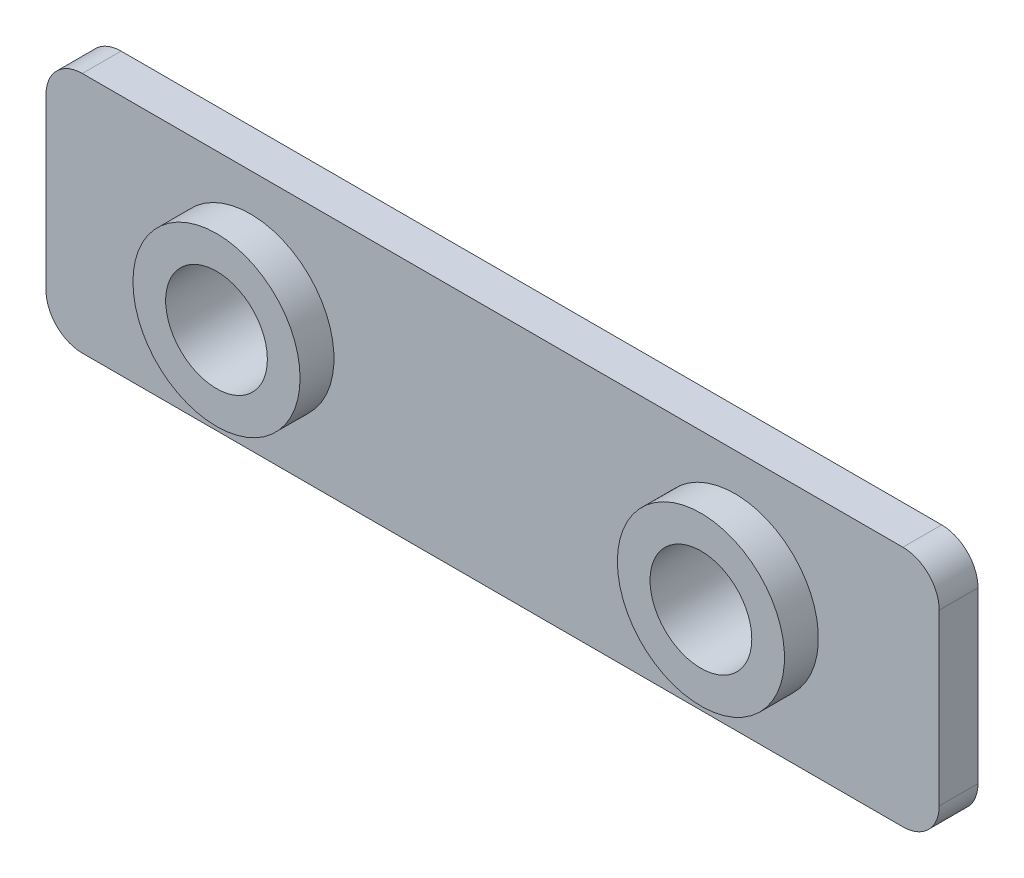
ISO-10303-21;
HEADER;
FILE_DESCRIPTION(('STEP AP214'),'2;1');
FILE_NAME('part.step','',(''),(''),'','','');
FILE_SCHEMA(('AUTOMOTIVE_DESIGN { 1 0 10303 214 1 1 1 1 }'));
ENDSEC;
DATA;
#1=APPLICATION_CONTEXT('core data for automotive mechanical design processes');
#2=APPLICATION_PROTOCOL_DEFINITION('international standard','automotive_design',2000,#1);
#3=PRODUCT_CONTEXT('',#1,'mechanical');
#4=PRODUCT('Part','Part','',(#3));
#5=PRODUCT_RELATED_PRODUCT_CATEGORY('part','',(#4));
#6=PRODUCT_DEFINITION_FORMATION('','',#4);
#7=PRODUCT_DEFINITION_CONTEXT('part definition',#1,'design');
#8=PRODUCT_DEFINITION('design','',#6,#7);
#9=PRODUCT_DEFINITION_SHAPE('','',#8);
#10=(LENGTH_UNIT() NAMED_UNIT(*) SI_UNIT(.MILLI.,.METRE.));
#11=(NAMED_UNIT(*) PLANE_ANGLE_UNIT() SI_UNIT($,.RADIAN.));
#12=(NAMED_UNIT(*) SI_UNIT($,.STERADIAN.) SOLID_ANGLE_UNIT());
#13=UNCERTAINTY_MEASURE_WITH_UNIT(LENGTH_MEASURE(1.E-05),#10,'distance_accuracy_value','');
#14=(GEOMETRIC_REPRESENTATION_CONTEXT(3) GLOBAL_UNCERTAINTY_ASSIGNED_CONTEXT((#13)) GLOBAL_UNIT_ASSIGNED_CONTEXT((#10,
#11,#12)) REPRESENTATION_CONTEXT('',''));
#15=CARTESIAN_POINT('',(0.,0.,0.));
#16=DIRECTION('',(0.,0.,1.));
#17=DIRECTION('',(1.,0.,0.));
#18=AXIS2_PLACEMENT_3D('',#15,#16,#17);
#19=CARTESIAN_POINT('',(16.94,3.5,1.6));
#20=DIRECTION('',(0.,0.,-1.));
#21=DIRECTION('',(-1.,0.,0.));
#22=AXIS2_PLACEMENT_3D('',#19,#20,#21);
#23=CYLINDRICAL_SURFACE('',#22,1.5);
#24=CARTESIAN_POINT('',(16.94,3.5,0.));
#25=DIRECTION('',(0.,0.,1.));
#26=DIRECTION('',(-1.,0.,0.));
#27=AXIS2_PLACEMENT_3D('',#24,#25,#26);
#28=CIRCLE('',#27,1.5);
#29=CARTESIAN_POINT('',(18.44,3.5,0.));
#30=VERTEX_POINT('',#29);
#31=CARTESIAN_POINT('',(16.94,5.,0.));
#32=VERTEX_POINT('',#31);
#33=EDGE_CURVE('E130',#30,#32,#28,.T.);
#34=ORIENTED_EDGE('',*,*,#33,.T.);
#35=DIRECTION('',(0.,0.,-1.));
#36=VECTOR('',#35,1.);
#37=CARTESIAN_POINT('',(16.94,5.,1.6));
#38=LINE('',#37,#36);
#39=CARTESIAN_POINT('',(16.94,5.,1.6));
#40=VERTEX_POINT('',#39);
#41=EDGE_CURVE('E158',#40,#32,#38,.T.);
#42=ORIENTED_EDGE('',*,*,#41,.F.);
#43=CARTESIAN_POINT('',(16.94,3.5,1.6));
#44=DIRECTION('',(0.,0.,1.));
#45=DIRECTION('',(-1.,0.,0.));
#46=AXIS2_PLACEMENT_3D('',#43,#44,#45);
#47=CIRCLE('',#46,1.5);
#48=CARTESIAN_POINT('',(18.44,3.5,1.6));
#49=VERTEX_POINT('',#48);
#50=EDGE_CURVE('E145',#49,#40,#47,.T.);
#51=ORIENTED_EDGE('',*,*,#50,.F.);
#52=DIRECTION('',(0.,0.,-1.));
#53=VECTOR('',#52,1.);
#54=CARTESIAN_POINT('',(18.44,3.5,1.6));
#55=LINE('',#54,#53);
#56=EDGE_CURVE('E126',#49,#30,#55,.T.);
#57=ORIENTED_EDGE('',*,*,#56,.T.);
#58=EDGE_LOOP('',(#34,#42,#51,#57));
#59=FACE_BOUND('',#58,.T.);
#60=ADVANCED_FACE('F33',(#59),#23,.T.);
#61=CARTESIAN_POINT('',(-16.94,5.,1.6));
#62=DIRECTION('',(0.,-1.,0.));
#63=DIRECTION('',(0.,0.,-1.));
#64=AXIS2_PLACEMENT_3D('',#61,#62,#63);
#65=PLANE('',#64);
#66=DIRECTION('',(-1.,0.,0.));
#67=VECTOR('',#66,1.);
#68=CARTESIAN_POINT('',(-16.94,5.,0.));
#69=LINE('',#68,#67);
#70=CARTESIAN_POINT('',(-16.94,5.,0.));
#71=VERTEX_POINT('',#70);
#72=EDGE_CURVE('E133',#32,#71,#69,.T.);
#73=ORIENTED_EDGE('',*,*,#72,.T.);
#74=DIRECTION('',(0.,0.,-1.));
#75=VECTOR('',#74,1.);
#76=CARTESIAN_POINT('',(-16.94,5.,1.6));
#77=LINE('',#76,#75);
#78=CARTESIAN_POINT('',(-16.94,5.,1.6));
#79=VERTEX_POINT('',#78);
#80=EDGE_CURVE('E155',#79,#71,#77,.T.);
#81=ORIENTED_EDGE('',*,*,#80,.F.);
#82=DIRECTION('',(-1.,0.,0.));
#83=VECTOR('',#82,1.);
#84=CARTESIAN_POINT('',(-16.94,5.,1.6));
#85=LINE('',#84,#83);
#86=EDGE_CURVE('E93',#40,#79,#85,.T.);
#87=ORIENTED_EDGE('',*,*,#86,.F.);
#88=ORIENTED_EDGE('',*,*,#41,.T.);
#89=EDGE_LOOP('',(#73,#81,#87,#88));
#90=FACE_BOUND('',#89,.T.);
#91=ADVANCED_FACE('F179',(#90),#65,.F.);
#92=CARTESIAN_POINT('',(-16.94,3.5,1.6));
#93=DIRECTION('',(0.,0.,-1.));
#94=DIRECTION('',(-1.,0.,0.));
#95=AXIS2_PLACEMENT_3D('',#92,#93,#94);
#96=CYLINDRICAL_SURFACE('',#95,1.5);
#97=CARTESIAN_POINT('',(-16.94,3.5,0.));
#98=DIRECTION('',(0.,0.,1.));
#99=DIRECTION('',(-1.,0.,0.));
#100=AXIS2_PLACEMENT_3D('',#97,#98,#99);
#101=CIRCLE('',#100,1.5);
#102=CARTESIAN_POINT('',(-18.44,3.5,0.));
#103=VERTEX_POINT('',#102);
#104=EDGE_CURVE('E136',#71,#103,#101,.T.);
#105=ORIENTED_EDGE('',*,*,#104,.T.);
#106=DIRECTION('',(0.,0.,-1.));
#107=VECTOR('',#106,1.);
#108=CARTESIAN_POINT('',(-18.44,3.5,1.6));
#109=LINE('',#108,#107);
#110=CARTESIAN_POINT('',(-18.44,3.5,1.6));
#111=VERTEX_POINT('',#110);
#112=EDGE_CURVE('E152',#111,#103,#109,.T.);
#113=ORIENTED_EDGE('',*,*,#112,.F.);
#114=CARTESIAN_POINT('',(-16.94,3.5,1.6));
#115=DIRECTION('',(0.,0.,1.));
#116=DIRECTION('',(-1.,0.,0.));
#117=AXIS2_PLACEMENT_3D('',#114,#115,#116);
#118=CIRCLE('',#117,1.5);
#119=EDGE_CURVE('E194',#79,#111,#118,.T.);
#120=ORIENTED_EDGE('',*,*,#119,.F.);
#121=ORIENTED_EDGE('',*,*,#80,.T.);
#122=EDGE_LOOP('',(#105,#113,#120,#121));
#123=FACE_BOUND('',#122,.T.);
#124=ADVANCED_FACE('F184',(#123),#96,.T.);
#125=CARTESIAN_POINT('',(-18.44,-3.5,1.6));
#126=DIRECTION('',(1.,0.,0.));
#127=DIRECTION('',(0.,0.,-1.));
#128=AXIS2_PLACEMENT_3D('',#125,#126,#127);
#129=PLANE('',#128);
#130=DIRECTION('',(0.,-1.,0.));
#131=VECTOR('',#130,1.);
#132=CARTESIAN_POINT('',(-18.44,-3.5,0.));
#133=LINE('',#132,#131);
#134=CARTESIAN_POINT('',(-18.44,-3.5,0.));
#135=VERTEX_POINT('',#134);
#136=EDGE_CURVE('E138',#103,#135,#133,.T.);
#137=ORIENTED_EDGE('',*,*,#136,.T.);
#138=DIRECTION('',(0.,0.,-1.));
#139=VECTOR('',#138,1.);
#140=CARTESIAN_POINT('',(-18.44,-3.5,1.6));
#141=LINE('',#140,#139);
#142=CARTESIAN_POINT('',(-18.44,-3.5,1.6));
#143=VERTEX_POINT('',#142);
#144=EDGE_CURVE('E149',#143,#135,#141,.T.);
#145=ORIENTED_EDGE('',*,*,#144,.F.);
#146=DIRECTION('',(0.,-1.,0.));
#147=VECTOR('',#146,1.);
#148=CARTESIAN_POINT('',(-18.44,-3.5,1.6));
#149=LINE('',#148,#147);
#150=EDGE_CURVE('E196',#111,#143,#149,.T.);
#151=ORIENTED_EDGE('',*,*,#150,.F.);
#152=ORIENTED_EDGE('',*,*,#112,.T.);
#153=EDGE_LOOP('',(#137,#145,#151,#152));
#154=FACE_BOUND('',#153,.T.);
#155=ADVANCED_FACE('F318',(#154),#129,.F.);
#156=CARTESIAN_POINT('',(-16.94,-3.5,1.6));
#157=DIRECTION('',(0.,0.,-1.));
#158=DIRECTION('',(-1.,0.,0.));
#159=AXIS2_PLACEMENT_3D('',#156,#157,#158);
#160=CYLINDRICAL_SURFACE('',#159,1.5);
#161=CARTESIAN_POINT('',(-16.94,-3.5,0.));
#162=DIRECTION('',(0.,0.,1.));
#163=DIRECTION('',(-1.,0.,0.));
#164=AXIS2_PLACEMENT_3D('',#161,#162,#163);
#165=CIRCLE('',#164,1.5);
#166=CARTESIAN_POINT('',(-16.94,-5.,0.));
#167=VERTEX_POINT('',#166);
#168=EDGE_CURVE('E140',#135,#167,#165,.T.);
#169=ORIENTED_EDGE('',*,*,#168,.T.);
#170=DIRECTION('',(0.,0.,-1.));
#171=VECTOR('',#170,1.);
#172=CARTESIAN_POINT('',(-16.94,-5.,1.6));
#173=LINE('',#172,#171);
#174=CARTESIAN_POINT('',(-16.94,-5.,1.6));
#175=VERTEX_POINT('',#174);
#176=EDGE_CURVE('E121',#175,#167,#173,.T.);
#177=ORIENTED_EDGE('',*,*,#176,.F.);
#178=CARTESIAN_POINT('',(-16.94,-3.5,1.6));
#179=DIRECTION('',(0.,0.,1.));
#180=DIRECTION('',(-1.,0.,0.));
#181=AXIS2_PLACEMENT_3D('',#178,#179,#180);
#182=CIRCLE('',#181,1.5);
#183=EDGE_CURVE('E112',#143,#175,#182,.T.);
#184=ORIENTED_EDGE('',*,*,#183,.F.);
#185=ORIENTED_EDGE('',*,*,#144,.T.);
#186=EDGE_LOOP('',(#169,#177,#184,#185));
#187=FACE_BOUND('',#186,.T.);
#188=ADVANCED_FACE('F309',(#187),#160,.T.);
#189=CARTESIAN_POINT('',(-16.94,-5.,1.6));
#190=DIRECTION('',(0.,1.,0.));
#191=DIRECTION('',(0.,0.,1.));
#192=AXIS2_PLACEMENT_3D('',#189,#190,#191);
#193=PLANE('',#192);
#194=DIRECTION('',(1.,0.,0.));
#195=VECTOR('',#194,1.);
#196=CARTESIAN_POINT('',(-16.94,-5.,0.));
#197=LINE('',#196,#195);
#198=CARTESIAN_POINT('',(16.94,-5.,0.));
#199=VERTEX_POINT('',#198);
#200=EDGE_CURVE('E120',#167,#199,#197,.T.);
#201=ORIENTED_EDGE('',*,*,#200,.T.);
#202=DIRECTION('',(0.,0.,-1.));
#203=VECTOR('',#202,1.);
#204=CARTESIAN_POINT('',(16.94,-5.,1.6));
#205=LINE('',#204,#203);
#206=CARTESIAN_POINT('',(16.94,-5.,1.6));
#207=VERTEX_POINT('',#206);
#208=EDGE_CURVE('E117',#207,#199,#205,.T.);
#209=ORIENTED_EDGE('',*,*,#208,.F.);
#210=DIRECTION('',(1.,0.,0.));
#211=VECTOR('',#210,1.);
#212=CARTESIAN_POINT('',(-16.94,-5.,1.6));
#213=LINE('',#212,#211);
#214=EDGE_CURVE('E106',#175,#207,#213,.T.);
#215=ORIENTED_EDGE('',*,*,#214,.F.);
#216=ORIENTED_EDGE('',*,*,#176,.T.);
#217=EDGE_LOOP('',(#201,#209,#215,#216));
#218=FACE_BOUND('',#217,.T.);
#219=ADVANCED_FACE('F118',(#218),#193,.F.);
#220=CARTESIAN_POINT('',(16.94,-3.5,1.6));
#221=DIRECTION('',(0.,0.,-1.));
#222=DIRECTION('',(-1.,0.,0.));
#223=AXIS2_PLACEMENT_3D('',#220,#221,#222);
#224=CYLINDRICAL_SURFACE('',#223,1.5);
#225=CARTESIAN_POINT('',(16.94,-3.5,0.));
#226=DIRECTION('',(0.,0.,1.));
#227=DIRECTION('',(1.,0.,0.));
#228=AXIS2_PLACEMENT_3D('',#225,#226,#227);
#229=CIRCLE('',#228,1.5);
#230=CARTESIAN_POINT('',(18.44,-3.5,0.));
#231=VERTEX_POINT('',#230);
#232=EDGE_CURVE('E78',#199,#231,#229,.T.);
#233=ORIENTED_EDGE('',*,*,#232,.T.);
#234=DIRECTION('',(0.,0.,-1.));
#235=VECTOR('',#234,1.);
#236=CARTESIAN_POINT('',(18.44,-3.5,1.6));
#237=LINE('',#236,#235);
#238=CARTESIAN_POINT('',(18.44,-3.5,1.6));
#239=VERTEX_POINT('',#238);
#240=EDGE_CURVE('E122',#239,#231,#237,.T.);
#241=ORIENTED_EDGE('',*,*,#240,.F.);
#242=CARTESIAN_POINT('',(16.94,-3.5,1.6));
#243=DIRECTION('',(0.,0.,1.));
#244=DIRECTION('',(1.,0.,0.));
#245=AXIS2_PLACEMENT_3D('',#242,#243,#244);
#246=CIRCLE('',#245,1.5);
#247=EDGE_CURVE('E110',#207,#239,#246,.T.);
#248=ORIENTED_EDGE('',*,*,#247,.F.);
#249=ORIENTED_EDGE('',*,*,#208,.T.);
#250=EDGE_LOOP('',(#233,#241,#248,#249));
#251=FACE_BOUND('',#250,.T.);
#252=ADVANCED_FACE('F124',(#251),#224,.T.);
#253=CARTESIAN_POINT('',(18.44,-3.5,1.6));
#254=DIRECTION('',(-1.,0.,0.));
#255=DIRECTION('',(0.,-1.,0.));
#256=AXIS2_PLACEMENT_3D('',#253,#254,#255);
#257=PLANE('',#256);
#258=DIRECTION('',(0.,1.,0.));
#259=VECTOR('',#258,1.);
#260=CARTESIAN_POINT('',(18.44,-3.5,0.));
#261=LINE('',#260,#259);
#262=EDGE_CURVE('E84',#231,#30,#261,.T.);
#263=ORIENTED_EDGE('',*,*,#262,.T.);
#264=ORIENTED_EDGE('',*,*,#56,.F.);
#265=DIRECTION('',(0.,1.,0.));
#266=VECTOR('',#265,1.);
#267=CARTESIAN_POINT('',(18.44,-3.5,1.6));
#268=LINE('',#267,#266);
#269=EDGE_CURVE('E49',#239,#49,#268,.T.);
#270=ORIENTED_EDGE('',*,*,#269,.F.);
#271=ORIENTED_EDGE('',*,*,#240,.T.);
#272=EDGE_LOOP('',(#263,#264,#270,#271));
#273=FACE_BOUND('',#272,.T.);
#274=ADVANCED_FACE('F166',(#273),#257,.F.);
#275=CARTESIAN_POINT('',(16.94,3.5,1.6));
#276=DIRECTION('',(0.,0.,-1.));
#277=DIRECTION('',(-1.,0.,0.));
#278=AXIS2_PLACEMENT_3D('',#275,#276,#277);
#279=PLANE('',#278);
#280=CARTESIAN_POINT('',(10.,0.,1.6));
#281=DIRECTION('',(0.,0.,-1.));
#282=DIRECTION('',(-1.,0.,0.));
#283=AXIS2_PLACEMENT_3D('',#280,#281,#282);
#284=CIRCLE('',#283,3.45);
#285=CARTESIAN_POINT('',(6.55,0.,1.6));
#286=VERTEX_POINT('',#285);
#287=EDGE_CURVE('E11',#286,#286,#284,.F.);
#288=ORIENTED_EDGE('',*,*,#287,.F.);
#289=EDGE_LOOP('',(#288));
#290=FACE_BOUND('',#289,.T.);
#291=CARTESIAN_POINT('',(-10.,0.,1.6));
#292=DIRECTION('',(0.,0.,-1.));
#293=DIRECTION('',(-1.,0.,0.));
#294=AXIS2_PLACEMENT_3D('',#291,#292,#293);
#295=CIRCLE('',#294,3.45);
#296=CARTESIAN_POINT('',(-13.45,0.,1.6));
#297=VERTEX_POINT('',#296);
#298=EDGE_CURVE('E41',#297,#297,#295,.F.);
#299=ORIENTED_EDGE('',*,*,#298,.F.);
#300=EDGE_LOOP('',(#299));
#301=FACE_BOUND('',#300,.T.);
#302=ORIENTED_EDGE('',*,*,#50,.T.);
#303=ORIENTED_EDGE('',*,*,#86,.T.);
#304=ORIENTED_EDGE('',*,*,#119,.T.);
#305=ORIENTED_EDGE('',*,*,#150,.T.);
#306=ORIENTED_EDGE('',*,*,#183,.T.);
#307=ORIENTED_EDGE('',*,*,#214,.T.);
#308=ORIENTED_EDGE('',*,*,#247,.T.);
#309=ORIENTED_EDGE('',*,*,#269,.T.);
#310=EDGE_LOOP('',(#302,#303,#304,#305,#306,#307,#308,#309));
#311=FACE_BOUND('',#310,.T.);
#312=ADVANCED_FACE('F108',(#290,#301,#311),#279,.F.);
#313=CARTESIAN_POINT('',(16.94,3.5,0.));
#314=DIRECTION('',(0.,0.,-1.));
#315=DIRECTION('',(-1.,0.,0.));
#316=AXIS2_PLACEMENT_3D('',#313,#314,#315);
#317=PLANE('',#316);
#318=CARTESIAN_POINT('',(-10.,0.,0.));
#319=DIRECTION('',(0.,0.,1.));
#320=DIRECTION('',(1.,0.,0.));
#321=AXIS2_PLACEMENT_3D('',#318,#319,#320);
#322=CIRCLE('',#321,2.1);
#323=CARTESIAN_POINT('',(-7.9,0.,0.));
#324=VERTEX_POINT('',#323);
#325=EDGE_CURVE('E213',#324,#324,#322,.T.);
#326=ORIENTED_EDGE('',*,*,#325,.T.);
#327=EDGE_LOOP('',(#326));
#328=FACE_BOUND('',#327,.T.);
#329=CARTESIAN_POINT('',(10.,0.,0.));
#330=DIRECTION('',(0.,0.,1.));
#331=DIRECTION('',(1.,0.,0.));
#332=AXIS2_PLACEMENT_3D('',#329,#330,#331);
#333=CIRCLE('',#332,2.1);
#334=CARTESIAN_POINT('',(12.1,0.,0.));
#335=VERTEX_POINT('',#334);
#336=EDGE_CURVE('E207',#335,#335,#333,.T.);
#337=ORIENTED_EDGE('',*,*,#336,.T.);
#338=EDGE_LOOP('',(#337));
#339=FACE_BOUND('',#338,.T.);
#340=ORIENTED_EDGE('',*,*,#33,.F.);
#341=ORIENTED_EDGE('',*,*,#262,.F.);
#342=ORIENTED_EDGE('',*,*,#232,.F.);
#343=ORIENTED_EDGE('',*,*,#200,.F.);
#344=ORIENTED_EDGE('',*,*,#168,.F.);
#345=ORIENTED_EDGE('',*,*,#136,.F.);
#346=ORIENTED_EDGE('',*,*,#104,.F.);
#347=ORIENTED_EDGE('',*,*,#72,.F.);
#348=EDGE_LOOP('',(#340,#341,#342,#343,#344,#345,#346,#347));
#349=FACE_BOUND('',#348,.T.);
#350=ADVANCED_FACE('F165',(#328,#339,#349),#317,.T.);
#351=CARTESIAN_POINT('',(-10.,0.,3.));
#352=DIRECTION('',(0.,0.,-1.));
#353=DIRECTION('',(-1.,0.,0.));
#354=AXIS2_PLACEMENT_3D('',#351,#352,#353);
#355=CYLINDRICAL_SURFACE('',#354,3.45);
#356=CARTESIAN_POINT('',(-10.,0.,3.));
#357=DIRECTION('',(0.,0.,1.));
#358=DIRECTION('',(1.,0.,0.));
#359=AXIS2_PLACEMENT_3D('',#356,#357,#358);
#360=CIRCLE('',#359,3.45);
#361=CARTESIAN_POINT('',(-6.55,0.,3.));
#362=VERTEX_POINT('',#361);
#363=EDGE_CURVE('E134',#362,#362,#360,.T.);
#364=ORIENTED_EDGE('',*,*,#363,.F.);
#365=EDGE_LOOP('',(#364));
#366=FACE_BOUND('',#365,.T.);
#367=ORIENTED_EDGE('',*,*,#298,.T.);
#368=EDGE_LOOP('',(#367));
#369=FACE_BOUND('',#368,.T.);
#370=ADVANCED_FACE('F162',(#366,#369),#355,.T.);
#371=CARTESIAN_POINT('',(-10.,0.,3.));
#372=DIRECTION('',(0.,0.,1.));
#373=DIRECTION('',(1.,0.,0.));
#374=AXIS2_PLACEMENT_3D('',#371,#372,#373);
#375=PLANE('',#374);
#376=CARTESIAN_POINT('',(-10.,0.,3.));
#377=DIRECTION('',(0.,0.,1.));
#378=DIRECTION('',(1.,0.,0.));
#379=AXIS2_PLACEMENT_3D('',#376,#377,#378);
#380=CIRCLE('',#379,2.09999999999999);
#381=CARTESIAN_POINT('',(-7.90000000000001,0.,3.));
#382=VERTEX_POINT('',#381);
#383=EDGE_CURVE('E216',#382,#382,#380,.T.);
#384=ORIENTED_EDGE('',*,*,#383,.F.);
#385=EDGE_LOOP('',(#384));
#386=FACE_BOUND('',#385,.T.);
#387=ORIENTED_EDGE('',*,*,#363,.T.);
#388=EDGE_LOOP('',(#387));
#389=FACE_BOUND('',#388,.T.);
#390=ADVANCED_FACE('F222',(#386,#389),#375,.T.);
#391=CARTESIAN_POINT('',(10.,0.,3.));
#392=DIRECTION('',(0.,0.,-1.));
#393=DIRECTION('',(-1.,0.,0.));
#394=AXIS2_PLACEMENT_3D('',#391,#392,#393);
#395=CYLINDRICAL_SURFACE('',#394,3.45);
#396=CARTESIAN_POINT('',(10.,0.,3.));
#397=DIRECTION('',(0.,0.,1.));
#398=DIRECTION('',(-1.,0.,0.));
#399=AXIS2_PLACEMENT_3D('',#396,#397,#398);
#400=CIRCLE('',#399,3.45);
#401=CARTESIAN_POINT('',(6.55,0.,3.));
#402=VERTEX_POINT('',#401);
#403=EDGE_CURVE('E204',#402,#402,#400,.T.);
#404=ORIENTED_EDGE('',*,*,#403,.F.);
#405=EDGE_LOOP('',(#404));
#406=FACE_BOUND('',#405,.T.);
#407=ORIENTED_EDGE('',*,*,#287,.T.);
#408=EDGE_LOOP('',(#407));
#409=FACE_BOUND('',#408,.T.);
#410=ADVANCED_FACE('F225',(#406,#409),#395,.T.);
#411=CARTESIAN_POINT('',(10.,0.,3.));
#412=DIRECTION('',(0.,0.,-1.));
#413=DIRECTION('',(-1.,0.,0.));
#414=AXIS2_PLACEMENT_3D('',#411,#412,#413);
#415=PLANE('',#414);
#416=CARTESIAN_POINT('',(10.,0.,3.));
#417=DIRECTION('',(0.,0.,1.));
#418=DIRECTION('',(1.,0.,0.));
#419=AXIS2_PLACEMENT_3D('',#416,#417,#418);
#420=CIRCLE('',#419,2.09999999999999);
#421=CARTESIAN_POINT('',(12.1,0.,3.));
#422=VERTEX_POINT('',#421);
#423=EDGE_CURVE('E210',#422,#422,#420,.T.);
#424=ORIENTED_EDGE('',*,*,#423,.F.);
#425=EDGE_LOOP('',(#424));
#426=FACE_BOUND('',#425,.T.);
#427=ORIENTED_EDGE('',*,*,#403,.T.);
#428=EDGE_LOOP('',(#427));
#429=FACE_BOUND('',#428,.T.);
#430=ADVANCED_FACE('F235',(#426,#429),#415,.F.);
#431=CARTESIAN_POINT('',(10.,0.,3.));
#432=DIRECTION('',(0.,0.,1.));
#433=DIRECTION('',(1.,0.,0.));
#434=AXIS2_PLACEMENT_3D('',#431,#432,#433);
#435=CYLINDRICAL_SURFACE('',#434,2.09999999999999);
#436=ORIENTED_EDGE('',*,*,#336,.F.);
#437=EDGE_LOOP('',(#436));
#438=FACE_BOUND('',#437,.T.);
#439=ORIENTED_EDGE('',*,*,#423,.T.);
#440=EDGE_LOOP('',(#439));
#441=FACE_BOUND('',#440,.T.);
#442=ADVANCED_FACE('F239',(#438,#441),#435,.F.);
#443=CARTESIAN_POINT('',(-10.,0.,3.));
#444=DIRECTION('',(0.,0.,1.));
#445=DIRECTION('',(1.,0.,0.));
#446=AXIS2_PLACEMENT_3D('',#443,#444,#445);
#447=CYLINDRICAL_SURFACE('',#446,2.09999999999999);
#448=ORIENTED_EDGE('',*,*,#325,.F.);
#449=EDGE_LOOP('',(#448));
#450=FACE_BOUND('',#449,.T.);
#451=ORIENTED_EDGE('',*,*,#383,.T.);
#452=EDGE_LOOP('',(#451));
#453=FACE_BOUND('',#452,.T.);
#454=ADVANCED_FACE('F220',(#450,#453),#447,.F.);
#455=CLOSED_SHELL('',(#60,#91,#124,#155,#188,#219,#252,#274,#312,#350,#370,#390,#410,#430,#442,#454));
#456=MANIFOLD_SOLID_BREP('B2',#455);
#457=ADVANCED_BREP_SHAPE_REPRESENTATION('',(#18,#456),#14);
#458=SHAPE_DEFINITION_REPRESENTATION(#9,#457);
ENDSEC;
END-ISO-10303-21;
